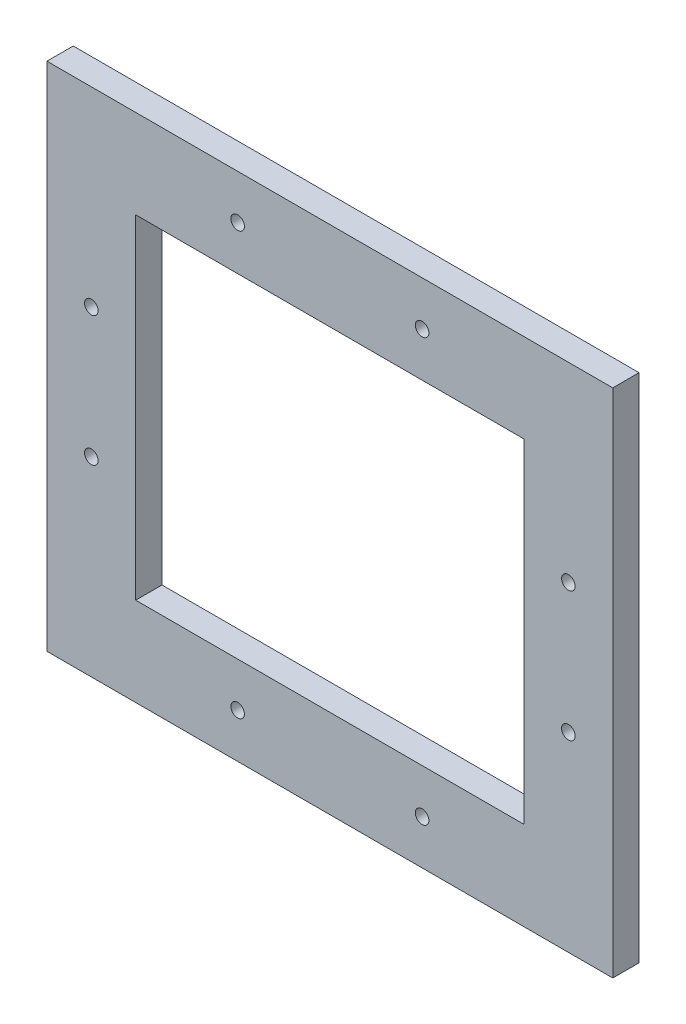
ISO-10303-21;
HEADER;
FILE_DESCRIPTION(('STEP AP214'),'2;1');
FILE_NAME('part.step','',(''),(''),'','','');
FILE_SCHEMA(('AUTOMOTIVE_DESIGN { 1 0 10303 214 1 1 1 1 }'));
ENDSEC;
DATA;
#1=APPLICATION_CONTEXT('core data for automotive mechanical design processes');
#2=APPLICATION_PROTOCOL_DEFINITION('international standard','automotive_design',2000,#1);
#3=PRODUCT_CONTEXT('',#1,'mechanical');
#4=PRODUCT('Part','Part','',(#3));
#5=PRODUCT_RELATED_PRODUCT_CATEGORY('part','',(#4));
#6=PRODUCT_DEFINITION_FORMATION('','',#4);
#7=PRODUCT_DEFINITION_CONTEXT('part definition',#1,'design');
#8=PRODUCT_DEFINITION('design','',#6,#7);
#9=PRODUCT_DEFINITION_SHAPE('','',#8);
#10=(LENGTH_UNIT() NAMED_UNIT(*) SI_UNIT(.MILLI.,.METRE.));
#11=(NAMED_UNIT(*) PLANE_ANGLE_UNIT() SI_UNIT($,.RADIAN.));
#12=(NAMED_UNIT(*) SI_UNIT($,.STERADIAN.) SOLID_ANGLE_UNIT());
#13=UNCERTAINTY_MEASURE_WITH_UNIT(LENGTH_MEASURE(1.E-05),#10,'distance_accuracy_value','');
#14=(GEOMETRIC_REPRESENTATION_CONTEXT(3) GLOBAL_UNCERTAINTY_ASSIGNED_CONTEXT((#13)) GLOBAL_UNIT_ASSIGNED_CONTEXT((#10,
#11,#12)) REPRESENTATION_CONTEXT('',''));
#15=CARTESIAN_POINT('',(0.,0.,0.));
#16=DIRECTION('',(0.,0.,1.));
#17=DIRECTION('',(1.,0.,0.));
#18=AXIS2_PLACEMENT_3D('',#15,#16,#17);
#19=CARTESIAN_POINT('',(0.,0.,6.));
#20=DIRECTION('',(0.,0.,1.));
#21=DIRECTION('',(1.,0.,0.));
#22=AXIS2_PLACEMENT_3D('',#19,#20,#21);
#23=PLANE('',#22);
#24=CARTESIAN_POINT('',(-13.0690840070405,18.3262197189021,6.));
#25=DIRECTION('',(0.,0.,-1.));
#26=DIRECTION('',(-1.,0.,0.));
#27=AXIS2_PLACEMENT_3D('',#24,#25,#26);
#28=CIRCLE('',#27,1.54999999999998);
#29=CARTESIAN_POINT('',(-14.6190840070405,18.3262197189021,6.));
#30=VERTEX_POINT('',#29);
#31=EDGE_CURVE('E254',#30,#30,#28,.T.);
#32=ORIENTED_EDGE('',*,*,#31,.T.);
#33=EDGE_LOOP('',(#32));
#34=FACE_BOUND('',#33,.T.);
#35=CARTESIAN_POINT('',(29.0413422203004,18.3262197189041,6.));
#36=DIRECTION('',(0.,0.,-1.));
#37=DIRECTION('',(-1.,0.,0.));
#38=AXIS2_PLACEMENT_3D('',#35,#36,#37);
#39=CIRCLE('',#38,1.55000000000001);
#40=CARTESIAN_POINT('',(27.4913422203004,18.3262197189041,6.));
#41=VERTEX_POINT('',#40);
#42=EDGE_CURVE('E262',#41,#41,#39,.T.);
#43=ORIENTED_EDGE('',*,*,#42,.T.);
#44=EDGE_LOOP('',(#43));
#45=FACE_BOUND('',#44,.T.);
#46=CARTESIAN_POINT('',(62.4364030042067,-15.0688410650027,6.));
#47=DIRECTION('',(0.,0.,-1.));
#48=DIRECTION('',(-1.,0.,0.));
#49=AXIS2_PLACEMENT_3D('',#46,#47,#48);
#50=CIRCLE('',#49,1.54999999999999);
#51=CARTESIAN_POINT('',(60.8864030042067,-15.0688410650027,6.));
#52=VERTEX_POINT('',#51);
#53=EDGE_CURVE('E268',#52,#52,#50,.T.);
#54=ORIENTED_EDGE('',*,*,#53,.T.);
#55=EDGE_LOOP('',(#54));
#56=FACE_BOUND('',#55,.T.);
#57=CARTESIAN_POINT('',(62.4364030042041,-44.6792672923412,6.));
#58=DIRECTION('',(0.,0.,-1.));
#59=DIRECTION('',(-1.,0.,0.));
#60=AXIS2_PLACEMENT_3D('',#57,#58,#59);
#61=CIRCLE('',#60,1.55000000000002);
#62=CARTESIAN_POINT('',(60.8864030042041,-44.6792672923412,6.));
#63=VERTEX_POINT('',#62);
#64=EDGE_CURVE('E274',#63,#63,#61,.T.);
#65=ORIENTED_EDGE('',*,*,#64,.T.);
#66=EDGE_LOOP('',(#65));
#67=FACE_BOUND('',#66,.T.);
#68=CARTESIAN_POINT('',(29.0413422202975,-78.0743280762477,6.));
#69=DIRECTION('',(0.,0.,-1.));
#70=DIRECTION('',(-1.,0.,0.));
#71=AXIS2_PLACEMENT_3D('',#68,#69,#70);
#72=CIRCLE('',#71,1.54999999999997);
#73=CARTESIAN_POINT('',(27.4913422202976,-78.0743280762477,6.));
#74=VERTEX_POINT('',#73);
#75=EDGE_CURVE('E280',#74,#74,#72,.T.);
#76=ORIENTED_EDGE('',*,*,#75,.T.);
#77=EDGE_LOOP('',(#76));
#78=FACE_BOUND('',#77,.T.);
#79=CARTESIAN_POINT('',(-13.0690840070394,-78.0743280762485,6.));
#80=DIRECTION('',(0.,0.,-1.));
#81=DIRECTION('',(-1.,0.,0.));
#82=AXIS2_PLACEMENT_3D('',#79,#80,#81);
#83=CIRCLE('',#82,1.55000000000001);
#84=CARTESIAN_POINT('',(-14.6190840070394,-78.0743280762485,6.));
#85=VERTEX_POINT('',#84);
#86=EDGE_CURVE('E286',#85,#85,#83,.T.);
#87=ORIENTED_EDGE('',*,*,#86,.T.);
#88=EDGE_LOOP('',(#87));
#89=FACE_BOUND('',#88,.T.);
#90=CARTESIAN_POINT('',(-46.4641447909457,-44.6792672923417,6.));
#91=DIRECTION('',(0.,0.,-1.));
#92=DIRECTION('',(-1.,0.,0.));
#93=AXIS2_PLACEMENT_3D('',#90,#91,#92);
#94=CIRCLE('',#93,1.54999999999999);
#95=CARTESIAN_POINT('',(-48.0141447909457,-44.6792672923417,6.));
#96=VERTEX_POINT('',#95);
#97=EDGE_CURVE('E292',#96,#96,#94,.T.);
#98=ORIENTED_EDGE('',*,*,#97,.T.);
#99=EDGE_LOOP('',(#98));
#100=FACE_BOUND('',#99,.T.);
#101=CARTESIAN_POINT('',(-46.4641447909473,-15.0688410650042,6.));
#102=DIRECTION('',(0.,0.,-1.));
#103=DIRECTION('',(-1.,0.,0.));
#104=AXIS2_PLACEMENT_3D('',#101,#102,#103);
#105=CIRCLE('',#104,1.55000000000001);
#106=CARTESIAN_POINT('',(-48.0141447909473,-15.0688410650042,6.));
#107=VERTEX_POINT('',#106);
#108=EDGE_CURVE('E128',#107,#107,#105,.T.);
#109=ORIENTED_EDGE('',*,*,#108,.T.);
#110=EDGE_LOOP('',(#109));
#111=FACE_BOUND('',#110,.T.);
#112=DIRECTION('',(0.,-1.,0.));
#113=VECTOR('',#112,1.);
#114=CARTESIAN_POINT('',(-56.5982708933718,28.4603458213256,6.));
#115=LINE('',#114,#113);
#116=CARTESIAN_POINT('',(-56.5982708933718,28.4603458213256,6.));
#117=VERTEX_POINT('',#116);
#118=CARTESIAN_POINT('',(-56.5982708933717,-88.2096541786744,6.));
#119=VERTEX_POINT('',#118);
#120=EDGE_CURVE('E138',#117,#119,#115,.T.);
#121=ORIENTED_EDGE('',*,*,#120,.T.);
#122=DIRECTION('',(1.,0.,0.));
#123=VECTOR('',#122,1.);
#124=CARTESIAN_POINT('',(-56.5982708933717,-88.2096541786744,6.));
#125=LINE('',#124,#123);
#126=CARTESIAN_POINT('',(72.5717291066282,-88.2096541786744,6.));
#127=VERTEX_POINT('',#126);
#128=EDGE_CURVE('E141',#119,#127,#125,.T.);
#129=ORIENTED_EDGE('',*,*,#128,.T.);
#130=DIRECTION('',(0.,1.,0.));
#131=VECTOR('',#130,1.);
#132=CARTESIAN_POINT('',(72.5717291066282,28.4603458213256,6.));
#133=LINE('',#132,#131);
#134=CARTESIAN_POINT('',(72.5717291066282,28.4603458213256,6.));
#135=VERTEX_POINT('',#134);
#136=EDGE_CURVE('E144',#127,#135,#133,.T.);
#137=ORIENTED_EDGE('',*,*,#136,.T.);
#138=DIRECTION('',(-1.,0.,0.));
#139=VECTOR('',#138,1.);
#140=CARTESIAN_POINT('',(-56.5982708933718,28.4603458213256,6.));
#141=LINE('',#140,#139);
#142=EDGE_CURVE('E146',#135,#117,#141,.T.);
#143=ORIENTED_EDGE('',*,*,#142,.T.);
#144=EDGE_LOOP('',(#121,#129,#137,#143));
#145=FACE_BOUND('',#144,.T.);
#146=DIRECTION('',(1.,0.,0.));
#147=VECTOR('',#146,1.);
#148=CARTESIAN_POINT('',(52.3117291066282,-67.9696541786744,6.));
#149=LINE('',#148,#147);
#150=CARTESIAN_POINT('',(-36.3382708933717,-67.9696541786744,6.));
#151=VERTEX_POINT('',#150);
#152=CARTESIAN_POINT('',(52.3117291066282,-67.9696541786744,6.));
#153=VERTEX_POINT('',#152);
#154=EDGE_CURVE('E108',#151,#153,#149,.T.);
#155=ORIENTED_EDGE('',*,*,#154,.F.);
#156=DIRECTION('',(0.,-1.,0.));
#157=VECTOR('',#156,1.);
#158=CARTESIAN_POINT('',(-36.3382708933717,-67.9696541786744,6.));
#159=LINE('',#158,#157);
#160=CARTESIAN_POINT('',(-36.3382708933718,8.22034582132563,6.));
#161=VERTEX_POINT('',#160);
#162=EDGE_CURVE('E100',#161,#151,#159,.T.);
#163=ORIENTED_EDGE('',*,*,#162,.F.);
#164=DIRECTION('',(-1.,0.,0.));
#165=VECTOR('',#164,1.);
#166=CARTESIAN_POINT('',(-36.3382708933718,8.22034582132563,6.));
#167=LINE('',#166,#165);
#168=CARTESIAN_POINT('',(52.3117291066282,8.22034582132563,6.));
#169=VERTEX_POINT('',#168);
#170=EDGE_CURVE('E122',#169,#161,#167,.T.);
#171=ORIENTED_EDGE('',*,*,#170,.F.);
#172=DIRECTION('',(0.,1.,0.));
#173=VECTOR('',#172,1.);
#174=CARTESIAN_POINT('',(52.3117291066282,8.22034582132563,6.));
#175=LINE('',#174,#173);
#176=EDGE_CURVE('E120',#153,#169,#175,.T.);
#177=ORIENTED_EDGE('',*,*,#176,.F.);
#178=EDGE_LOOP('',(#155,#163,#171,#177));
#179=FACE_BOUND('',#178,.T.);
#180=ADVANCED_FACE('F35',(#34,#45,#56,#67,#78,#89,#100,#111,#145,#179),#23,.T.);
#181=CARTESIAN_POINT('',(0.,0.,0.));
#182=DIRECTION('',(0.,0.,1.));
#183=DIRECTION('',(1.,0.,0.));
#184=AXIS2_PLACEMENT_3D('',#181,#182,#183);
#185=PLANE('',#184);
#186=CARTESIAN_POINT('',(-13.0690840070405,18.3262197189021,0.));
#187=DIRECTION('',(0.,0.,-1.));
#188=DIRECTION('',(-1.,0.,0.));
#189=AXIS2_PLACEMENT_3D('',#186,#187,#188);
#190=CIRCLE('',#189,1.54999999999998);
#191=CARTESIAN_POINT('',(-14.6190840070405,18.3262197189021,0.));
#192=VERTEX_POINT('',#191);
#193=EDGE_CURVE('E257',#192,#192,#190,.T.);
#194=ORIENTED_EDGE('',*,*,#193,.F.);
#195=EDGE_LOOP('',(#194));
#196=FACE_BOUND('',#195,.T.);
#197=CARTESIAN_POINT('',(29.0413422203004,18.3262197189041,0.));
#198=DIRECTION('',(0.,0.,-1.));
#199=DIRECTION('',(-1.,0.,0.));
#200=AXIS2_PLACEMENT_3D('',#197,#198,#199);
#201=CIRCLE('',#200,1.55000000000001);
#202=CARTESIAN_POINT('',(27.4913422203004,18.3262197189041,0.));
#203=VERTEX_POINT('',#202);
#204=EDGE_CURVE('E259',#203,#203,#201,.T.);
#205=ORIENTED_EDGE('',*,*,#204,.F.);
#206=EDGE_LOOP('',(#205));
#207=FACE_BOUND('',#206,.T.);
#208=CARTESIAN_POINT('',(62.4364030042067,-15.0688410650027,0.));
#209=DIRECTION('',(0.,0.,-1.));
#210=DIRECTION('',(-1.,0.,0.));
#211=AXIS2_PLACEMENT_3D('',#208,#209,#210);
#212=CIRCLE('',#211,1.54999999999999);
#213=CARTESIAN_POINT('',(60.8864030042067,-15.0688410650027,0.));
#214=VERTEX_POINT('',#213);
#215=EDGE_CURVE('E265',#214,#214,#212,.T.);
#216=ORIENTED_EDGE('',*,*,#215,.F.);
#217=EDGE_LOOP('',(#216));
#218=FACE_BOUND('',#217,.T.);
#219=CARTESIAN_POINT('',(62.4364030042041,-44.6792672923412,0.));
#220=DIRECTION('',(0.,0.,-1.));
#221=DIRECTION('',(-1.,0.,0.));
#222=AXIS2_PLACEMENT_3D('',#219,#220,#221);
#223=CIRCLE('',#222,1.55000000000002);
#224=CARTESIAN_POINT('',(60.8864030042041,-44.6792672923412,0.));
#225=VERTEX_POINT('',#224);
#226=EDGE_CURVE('E271',#225,#225,#223,.T.);
#227=ORIENTED_EDGE('',*,*,#226,.F.);
#228=EDGE_LOOP('',(#227));
#229=FACE_BOUND('',#228,.T.);
#230=CARTESIAN_POINT('',(29.0413422202975,-78.0743280762477,0.));
#231=DIRECTION('',(0.,0.,-1.));
#232=DIRECTION('',(-1.,0.,0.));
#233=AXIS2_PLACEMENT_3D('',#230,#231,#232);
#234=CIRCLE('',#233,1.54999999999997);
#235=CARTESIAN_POINT('',(27.4913422202976,-78.0743280762477,0.));
#236=VERTEX_POINT('',#235);
#237=EDGE_CURVE('E277',#236,#236,#234,.T.);
#238=ORIENTED_EDGE('',*,*,#237,.F.);
#239=EDGE_LOOP('',(#238));
#240=FACE_BOUND('',#239,.T.);
#241=CARTESIAN_POINT('',(-13.0690840070394,-78.0743280762485,0.));
#242=DIRECTION('',(0.,0.,-1.));
#243=DIRECTION('',(-1.,0.,0.));
#244=AXIS2_PLACEMENT_3D('',#241,#242,#243);
#245=CIRCLE('',#244,1.55000000000001);
#246=CARTESIAN_POINT('',(-14.6190840070394,-78.0743280762485,0.));
#247=VERTEX_POINT('',#246);
#248=EDGE_CURVE('E283',#247,#247,#245,.T.);
#249=ORIENTED_EDGE('',*,*,#248,.F.);
#250=EDGE_LOOP('',(#249));
#251=FACE_BOUND('',#250,.T.);
#252=CARTESIAN_POINT('',(-46.4641447909457,-44.6792672923417,0.));
#253=DIRECTION('',(0.,0.,-1.));
#254=DIRECTION('',(-1.,0.,0.));
#255=AXIS2_PLACEMENT_3D('',#252,#253,#254);
#256=CIRCLE('',#255,1.54999999999999);
#257=CARTESIAN_POINT('',(-48.0141447909457,-44.6792672923417,0.));
#258=VERTEX_POINT('',#257);
#259=EDGE_CURVE('E289',#258,#258,#256,.T.);
#260=ORIENTED_EDGE('',*,*,#259,.F.);
#261=EDGE_LOOP('',(#260));
#262=FACE_BOUND('',#261,.T.);
#263=CARTESIAN_POINT('',(-46.4641447909473,-15.0688410650042,0.));
#264=DIRECTION('',(0.,0.,-1.));
#265=DIRECTION('',(-1.,0.,0.));
#266=AXIS2_PLACEMENT_3D('',#263,#264,#265);
#267=CIRCLE('',#266,1.55000000000001);
#268=CARTESIAN_POINT('',(-48.0141447909473,-15.0688410650042,0.));
#269=VERTEX_POINT('',#268);
#270=EDGE_CURVE('E295',#269,#269,#267,.T.);
#271=ORIENTED_EDGE('',*,*,#270,.F.);
#272=EDGE_LOOP('',(#271));
#273=FACE_BOUND('',#272,.T.);
#274=DIRECTION('',(0.,-1.,0.));
#275=VECTOR('',#274,1.);
#276=CARTESIAN_POINT('',(-56.5982708933718,28.4603458213256,0.));
#277=LINE('',#276,#275);
#278=CARTESIAN_POINT('',(-56.5982708933718,28.4603458213256,0.));
#279=VERTEX_POINT('',#278);
#280=CARTESIAN_POINT('',(-56.5982708933717,-88.2096541786744,0.));
#281=VERTEX_POINT('',#280);
#282=EDGE_CURVE('E116',#279,#281,#277,.T.);
#283=ORIENTED_EDGE('',*,*,#282,.F.);
#284=DIRECTION('',(-1.,0.,0.));
#285=VECTOR('',#284,1.);
#286=CARTESIAN_POINT('',(-56.5982708933718,28.4603458213256,0.));
#287=LINE('',#286,#285);
#288=CARTESIAN_POINT('',(72.5717291066282,28.4603458213256,0.));
#289=VERTEX_POINT('',#288);
#290=EDGE_CURVE('E142',#289,#279,#287,.T.);
#291=ORIENTED_EDGE('',*,*,#290,.F.);
#292=DIRECTION('',(0.,1.,0.));
#293=VECTOR('',#292,1.);
#294=CARTESIAN_POINT('',(72.5717291066282,28.4603458213256,0.));
#295=LINE('',#294,#293);
#296=CARTESIAN_POINT('',(72.5717291066282,-88.2096541786744,0.));
#297=VERTEX_POINT('',#296);
#298=EDGE_CURVE('E153',#297,#289,#295,.T.);
#299=ORIENTED_EDGE('',*,*,#298,.F.);
#300=DIRECTION('',(1.,0.,0.));
#301=VECTOR('',#300,1.);
#302=CARTESIAN_POINT('',(-56.5982708933717,-88.2096541786744,0.));
#303=LINE('',#302,#301);
#304=EDGE_CURVE('E151',#281,#297,#303,.T.);
#305=ORIENTED_EDGE('',*,*,#304,.F.);
#306=EDGE_LOOP('',(#283,#291,#299,#305));
#307=FACE_BOUND('',#306,.T.);
#308=DIRECTION('',(0.,-1.,0.));
#309=VECTOR('',#308,1.);
#310=CARTESIAN_POINT('',(-36.3382708933717,-67.9696541786744,0.));
#311=LINE('',#310,#309);
#312=CARTESIAN_POINT('',(-36.3382708933718,8.22034582132563,0.));
#313=VERTEX_POINT('',#312);
#314=CARTESIAN_POINT('',(-36.3382708933717,-67.9696541786744,0.));
#315=VERTEX_POINT('',#314);
#316=EDGE_CURVE('E58',#313,#315,#311,.T.);
#317=ORIENTED_EDGE('',*,*,#316,.T.);
#318=DIRECTION('',(1.,0.,0.));
#319=VECTOR('',#318,1.);
#320=CARTESIAN_POINT('',(52.3117291066282,-67.9696541786744,0.));
#321=LINE('',#320,#319);
#322=CARTESIAN_POINT('',(52.3117291066282,-67.9696541786744,0.));
#323=VERTEX_POINT('',#322);
#324=EDGE_CURVE('E115',#315,#323,#321,.T.);
#325=ORIENTED_EDGE('',*,*,#324,.T.);
#326=DIRECTION('',(0.,1.,0.));
#327=VECTOR('',#326,1.);
#328=CARTESIAN_POINT('',(52.3117291066282,8.22034582132563,0.));
#329=LINE('',#328,#327);
#330=CARTESIAN_POINT('',(52.3117291066282,8.22034582132563,0.));
#331=VERTEX_POINT('',#330);
#332=EDGE_CURVE('E130',#323,#331,#329,.T.);
#333=ORIENTED_EDGE('',*,*,#332,.T.);
#334=DIRECTION('',(-1.,0.,0.));
#335=VECTOR('',#334,1.);
#336=CARTESIAN_POINT('',(-36.3382708933718,8.22034582132563,0.));
#337=LINE('',#336,#335);
#338=EDGE_CURVE('E109',#331,#313,#337,.T.);
#339=ORIENTED_EDGE('',*,*,#338,.T.);
#340=EDGE_LOOP('',(#317,#325,#333,#339));
#341=FACE_BOUND('',#340,.T.);
#342=ADVANCED_FACE('F171',(#196,#207,#218,#229,#240,#251,#262,#273,#307,#341),#185,.F.);
#343=CARTESIAN_POINT('',(-56.5982708933718,28.4603458213256,6.));
#344=DIRECTION('',(1.,0.,0.));
#345=DIRECTION('',(0.,1.,0.));
#346=AXIS2_PLACEMENT_3D('',#343,#344,#345);
#347=PLANE('',#346);
#348=ORIENTED_EDGE('',*,*,#282,.T.);
#349=DIRECTION('',(0.,0.,-1.));
#350=VECTOR('',#349,1.);
#351=CARTESIAN_POINT('',(-56.5982708933717,-88.2096541786744,6.));
#352=LINE('',#351,#350);
#353=EDGE_CURVE('E11',#119,#281,#352,.T.);
#354=ORIENTED_EDGE('',*,*,#353,.F.);
#355=ORIENTED_EDGE('',*,*,#120,.F.);
#356=DIRECTION('',(0.,0.,-1.));
#357=VECTOR('',#356,1.);
#358=CARTESIAN_POINT('',(-56.5982708933718,28.4603458213256,6.));
#359=LINE('',#358,#357);
#360=EDGE_CURVE('E148',#117,#279,#359,.T.);
#361=ORIENTED_EDGE('',*,*,#360,.T.);
#362=EDGE_LOOP('',(#348,#354,#355,#361));
#363=FACE_BOUND('',#362,.T.);
#364=ADVANCED_FACE('F37',(#363),#347,.F.);
#365=CARTESIAN_POINT('',(-56.5982708933717,-88.2096541786744,6.));
#366=DIRECTION('',(0.,1.,0.));
#367=DIRECTION('',(0.,0.,1.));
#368=AXIS2_PLACEMENT_3D('',#365,#366,#367);
#369=PLANE('',#368);
#370=ORIENTED_EDGE('',*,*,#304,.T.);
#371=DIRECTION('',(0.,0.,-1.));
#372=VECTOR('',#371,1.);
#373=CARTESIAN_POINT('',(72.5717291066282,-88.2096541786744,6.));
#374=LINE('',#373,#372);
#375=EDGE_CURVE('E43',#127,#297,#374,.T.);
#376=ORIENTED_EDGE('',*,*,#375,.F.);
#377=ORIENTED_EDGE('',*,*,#128,.F.);
#378=ORIENTED_EDGE('',*,*,#353,.T.);
#379=EDGE_LOOP('',(#370,#376,#377,#378));
#380=FACE_BOUND('',#379,.T.);
#381=ADVANCED_FACE('F181',(#380),#369,.F.);
#382=CARTESIAN_POINT('',(72.5717291066282,28.4603458213256,6.));
#383=DIRECTION('',(-1.,0.,0.));
#384=DIRECTION('',(0.,-1.,0.));
#385=AXIS2_PLACEMENT_3D('',#382,#383,#384);
#386=PLANE('',#385);
#387=ORIENTED_EDGE('',*,*,#298,.T.);
#388=DIRECTION('',(0.,0.,-1.));
#389=VECTOR('',#388,1.);
#390=CARTESIAN_POINT('',(72.5717291066282,28.4603458213256,6.));
#391=LINE('',#390,#389);
#392=EDGE_CURVE('E158',#135,#289,#391,.T.);
#393=ORIENTED_EDGE('',*,*,#392,.F.);
#394=ORIENTED_EDGE('',*,*,#136,.F.);
#395=ORIENTED_EDGE('',*,*,#375,.T.);
#396=EDGE_LOOP('',(#387,#393,#394,#395));
#397=FACE_BOUND('',#396,.T.);
#398=ADVANCED_FACE('F165',(#397),#386,.F.);
#399=CARTESIAN_POINT('',(-56.5982708933718,28.4603458213256,6.));
#400=DIRECTION('',(0.,-1.,0.));
#401=DIRECTION('',(1.,0.,0.));
#402=AXIS2_PLACEMENT_3D('',#399,#400,#401);
#403=PLANE('',#402);
#404=ORIENTED_EDGE('',*,*,#290,.T.);
#405=ORIENTED_EDGE('',*,*,#360,.F.);
#406=ORIENTED_EDGE('',*,*,#142,.F.);
#407=ORIENTED_EDGE('',*,*,#392,.T.);
#408=EDGE_LOOP('',(#404,#405,#406,#407));
#409=FACE_BOUND('',#408,.T.);
#410=ADVANCED_FACE('F175',(#409),#403,.F.);
#411=CARTESIAN_POINT('',(-36.3382708933717,-67.9696541786744,6.));
#412=DIRECTION('',(1.,0.,0.));
#413=DIRECTION('',(0.,1.,0.));
#414=AXIS2_PLACEMENT_3D('',#411,#412,#413);
#415=PLANE('',#414);
#416=ORIENTED_EDGE('',*,*,#316,.F.);
#417=DIRECTION('',(0.,0.,-1.));
#418=VECTOR('',#417,1.);
#419=CARTESIAN_POINT('',(-36.3382708933718,8.22034582132563,6.));
#420=LINE('',#419,#418);
#421=EDGE_CURVE('E104',#161,#313,#420,.T.);
#422=ORIENTED_EDGE('',*,*,#421,.F.);
#423=ORIENTED_EDGE('',*,*,#162,.T.);
#424=DIRECTION('',(0.,0.,-1.));
#425=VECTOR('',#424,1.);
#426=CARTESIAN_POINT('',(-36.3382708933717,-67.9696541786744,6.));
#427=LINE('',#426,#425);
#428=EDGE_CURVE('E103',#151,#315,#427,.T.);
#429=ORIENTED_EDGE('',*,*,#428,.T.);
#430=EDGE_LOOP('',(#416,#422,#423,#429));
#431=FACE_BOUND('',#430,.T.);
#432=ADVANCED_FACE('F102',(#431),#415,.T.);
#433=CARTESIAN_POINT('',(52.3117291066282,-67.9696541786744,6.));
#434=DIRECTION('',(0.,1.,0.));
#435=DIRECTION('',(-1.,0.,0.));
#436=AXIS2_PLACEMENT_3D('',#433,#434,#435);
#437=PLANE('',#436);
#438=ORIENTED_EDGE('',*,*,#324,.F.);
#439=ORIENTED_EDGE('',*,*,#428,.F.);
#440=ORIENTED_EDGE('',*,*,#154,.T.);
#441=DIRECTION('',(0.,0.,-1.));
#442=VECTOR('',#441,1.);
#443=CARTESIAN_POINT('',(52.3117291066282,-67.9696541786744,6.));
#444=LINE('',#443,#442);
#445=EDGE_CURVE('E117',#153,#323,#444,.T.);
#446=ORIENTED_EDGE('',*,*,#445,.T.);
#447=EDGE_LOOP('',(#438,#439,#440,#446));
#448=FACE_BOUND('',#447,.T.);
#449=ADVANCED_FACE('F112',(#448),#437,.T.);
#450=CARTESIAN_POINT('',(52.3117291066282,8.22034582132563,6.));
#451=DIRECTION('',(-1.,0.,0.));
#452=DIRECTION('',(0.,0.,1.));
#453=AXIS2_PLACEMENT_3D('',#450,#451,#452);
#454=PLANE('',#453);
#455=ORIENTED_EDGE('',*,*,#332,.F.);
#456=ORIENTED_EDGE('',*,*,#445,.F.);
#457=ORIENTED_EDGE('',*,*,#176,.T.);
#458=DIRECTION('',(0.,0.,-1.));
#459=VECTOR('',#458,1.);
#460=CARTESIAN_POINT('',(52.3117291066282,8.22034582132563,6.));
#461=LINE('',#460,#459);
#462=EDGE_CURVE('E50',#169,#331,#461,.T.);
#463=ORIENTED_EDGE('',*,*,#462,.T.);
#464=EDGE_LOOP('',(#455,#456,#457,#463));
#465=FACE_BOUND('',#464,.T.);
#466=ADVANCED_FACE('F209',(#465),#454,.T.);
#467=CARTESIAN_POINT('',(-36.3382708933718,8.22034582132563,6.));
#468=DIRECTION('',(0.,-1.,0.));
#469=DIRECTION('',(0.,0.,-1.));
#470=AXIS2_PLACEMENT_3D('',#467,#468,#469);
#471=PLANE('',#470);
#472=ORIENTED_EDGE('',*,*,#338,.F.);
#473=ORIENTED_EDGE('',*,*,#462,.F.);
#474=ORIENTED_EDGE('',*,*,#170,.T.);
#475=ORIENTED_EDGE('',*,*,#421,.T.);
#476=EDGE_LOOP('',(#472,#473,#474,#475));
#477=FACE_BOUND('',#476,.T.);
#478=ADVANCED_FACE('F213',(#477),#471,.T.);
#479=CARTESIAN_POINT('',(-46.4641447909473,-15.0688410650042,6.));
#480=DIRECTION('',(0.,0.,-1.));
#481=DIRECTION('',(-1.,0.,0.));
#482=AXIS2_PLACEMENT_3D('',#479,#480,#481);
#483=CYLINDRICAL_SURFACE('',#482,1.55000000000001);
#484=ORIENTED_EDGE('',*,*,#108,.F.);
#485=EDGE_LOOP('',(#484));
#486=FACE_BOUND('',#485,.T.);
#487=ORIENTED_EDGE('',*,*,#270,.T.);
#488=EDGE_LOOP('',(#487));
#489=FACE_BOUND('',#488,.T.);
#490=ADVANCED_FACE('F219',(#486,#489),#483,.F.);
#491=CARTESIAN_POINT('',(-46.4641447909457,-44.6792672923417,6.));
#492=DIRECTION('',(0.,0.,-1.));
#493=DIRECTION('',(-1.,0.,0.));
#494=AXIS2_PLACEMENT_3D('',#491,#492,#493);
#495=CYLINDRICAL_SURFACE('',#494,1.54999999999999);
#496=ORIENTED_EDGE('',*,*,#97,.F.);
#497=EDGE_LOOP('',(#496));
#498=FACE_BOUND('',#497,.T.);
#499=ORIENTED_EDGE('',*,*,#259,.T.);
#500=EDGE_LOOP('',(#499));
#501=FACE_BOUND('',#500,.T.);
#502=ADVANCED_FACE('F222',(#498,#501),#495,.F.);
#503=CARTESIAN_POINT('',(-13.0690840070394,-78.0743280762485,6.));
#504=DIRECTION('',(0.,0.,-1.));
#505=DIRECTION('',(-1.,0.,0.));
#506=AXIS2_PLACEMENT_3D('',#503,#504,#505);
#507=CYLINDRICAL_SURFACE('',#506,1.55000000000001);
#508=ORIENTED_EDGE('',*,*,#86,.F.);
#509=EDGE_LOOP('',(#508));
#510=FACE_BOUND('',#509,.T.);
#511=ORIENTED_EDGE('',*,*,#248,.T.);
#512=EDGE_LOOP('',(#511));
#513=FACE_BOUND('',#512,.T.);
#514=ADVANCED_FACE('F226',(#510,#513),#507,.F.);
#515=CARTESIAN_POINT('',(29.0413422202975,-78.0743280762477,6.));
#516=DIRECTION('',(0.,0.,-1.));
#517=DIRECTION('',(-1.,0.,0.));
#518=AXIS2_PLACEMENT_3D('',#515,#516,#517);
#519=CYLINDRICAL_SURFACE('',#518,1.54999999999997);
#520=ORIENTED_EDGE('',*,*,#75,.F.);
#521=EDGE_LOOP('',(#520));
#522=FACE_BOUND('',#521,.T.);
#523=ORIENTED_EDGE('',*,*,#237,.T.);
#524=EDGE_LOOP('',(#523));
#525=FACE_BOUND('',#524,.T.);
#526=ADVANCED_FACE('F230',(#522,#525),#519,.F.);
#527=CARTESIAN_POINT('',(62.4364030042041,-44.6792672923412,6.));
#528=DIRECTION('',(0.,0.,-1.));
#529=DIRECTION('',(-1.,0.,0.));
#530=AXIS2_PLACEMENT_3D('',#527,#528,#529);
#531=CYLINDRICAL_SURFACE('',#530,1.55000000000002);
#532=ORIENTED_EDGE('',*,*,#64,.F.);
#533=EDGE_LOOP('',(#532));
#534=FACE_BOUND('',#533,.T.);
#535=ORIENTED_EDGE('',*,*,#226,.T.);
#536=EDGE_LOOP('',(#535));
#537=FACE_BOUND('',#536,.T.);
#538=ADVANCED_FACE('F234',(#534,#537),#531,.F.);
#539=CARTESIAN_POINT('',(62.4364030042067,-15.0688410650027,6.));
#540=DIRECTION('',(0.,0.,-1.));
#541=DIRECTION('',(-1.,0.,0.));
#542=AXIS2_PLACEMENT_3D('',#539,#540,#541);
#543=CYLINDRICAL_SURFACE('',#542,1.54999999999999);
#544=ORIENTED_EDGE('',*,*,#53,.F.);
#545=EDGE_LOOP('',(#544));
#546=FACE_BOUND('',#545,.T.);
#547=ORIENTED_EDGE('',*,*,#215,.T.);
#548=EDGE_LOOP('',(#547));
#549=FACE_BOUND('',#548,.T.);
#550=ADVANCED_FACE('F238',(#546,#549),#543,.F.);
#551=CARTESIAN_POINT('',(29.0413422203004,18.3262197189041,6.));
#552=DIRECTION('',(0.,0.,-1.));
#553=DIRECTION('',(-1.,0.,0.));
#554=AXIS2_PLACEMENT_3D('',#551,#552,#553);
#555=CYLINDRICAL_SURFACE('',#554,1.55000000000001);
#556=ORIENTED_EDGE('',*,*,#42,.F.);
#557=EDGE_LOOP('',(#556));
#558=FACE_BOUND('',#557,.T.);
#559=ORIENTED_EDGE('',*,*,#204,.T.);
#560=EDGE_LOOP('',(#559));
#561=FACE_BOUND('',#560,.T.);
#562=ADVANCED_FACE('F242',(#558,#561),#555,.F.);
#563=CARTESIAN_POINT('',(-13.0690840070405,18.3262197189021,6.));
#564=DIRECTION('',(0.,0.,-1.));
#565=DIRECTION('',(-1.,0.,0.));
#566=AXIS2_PLACEMENT_3D('',#563,#564,#565);
#567=CYLINDRICAL_SURFACE('',#566,1.54999999999998);
#568=ORIENTED_EDGE('',*,*,#31,.F.);
#569=EDGE_LOOP('',(#568));
#570=FACE_BOUND('',#569,.T.);
#571=ORIENTED_EDGE('',*,*,#193,.T.);
#572=EDGE_LOOP('',(#571));
#573=FACE_BOUND('',#572,.T.);
#574=ADVANCED_FACE('F246',(#570,#573),#567,.F.);
#575=CLOSED_SHELL('',(#180,#342,#364,#381,#398,#410,#432,#449,#466,#478,#490,#502,#514,#526,
#538,#550,#562,#574));
#576=MANIFOLD_SOLID_BREP('B2',#575);
#577=ADVANCED_BREP_SHAPE_REPRESENTATION('',(#18,#576),#14);
#578=SHAPE_DEFINITION_REPRESENTATION(#9,#577);
ENDSEC;
END-ISO-10303-21;
